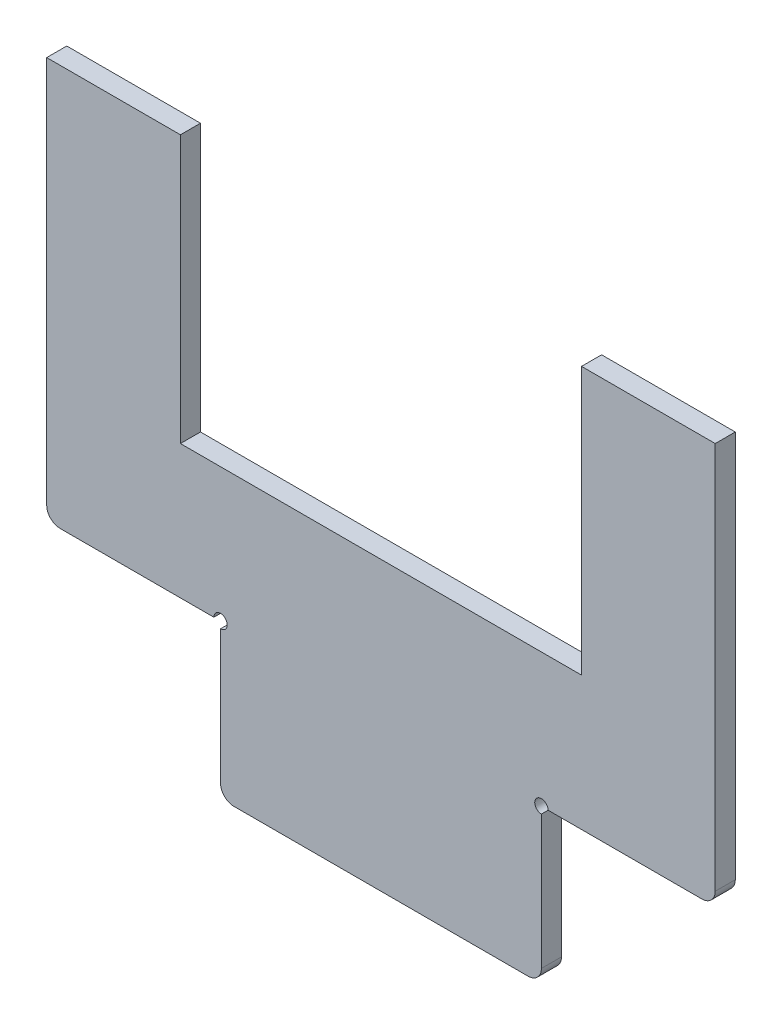
ISO-10303-21;
HEADER;
FILE_DESCRIPTION(('STEP AP214'),'2;1');
FILE_NAME('part.step','',(''),(''),'','','');
FILE_SCHEMA(('AUTOMOTIVE_DESIGN { 1 0 10303 214 1 1 1 1 }'));
ENDSEC;
DATA;
#1=APPLICATION_CONTEXT('core data for automotive mechanical design processes');
#2=APPLICATION_PROTOCOL_DEFINITION('international standard','automotive_design',2000,#1);
#3=PRODUCT_CONTEXT('',#1,'mechanical');
#4=PRODUCT('Part','Part','',(#3));
#5=PRODUCT_RELATED_PRODUCT_CATEGORY('part','',(#4));
#6=PRODUCT_DEFINITION_FORMATION('','',#4);
#7=PRODUCT_DEFINITION_CONTEXT('part definition',#1,'design');
#8=PRODUCT_DEFINITION('design','',#6,#7);
#9=PRODUCT_DEFINITION_SHAPE('','',#8);
#10=(LENGTH_UNIT() NAMED_UNIT(*) SI_UNIT(.MILLI.,.METRE.));
#11=(NAMED_UNIT(*) PLANE_ANGLE_UNIT() SI_UNIT($,.RADIAN.));
#12=(NAMED_UNIT(*) SI_UNIT($,.STERADIAN.) SOLID_ANGLE_UNIT());
#13=UNCERTAINTY_MEASURE_WITH_UNIT(LENGTH_MEASURE(1.E-05),#10,'distance_accuracy_value','');
#14=(GEOMETRIC_REPRESENTATION_CONTEXT(3) GLOBAL_UNCERTAINTY_ASSIGNED_CONTEXT((#13)) GLOBAL_UNIT_ASSIGNED_CONTEXT((#10,
#11,#12)) REPRESENTATION_CONTEXT('',''));
#15=CARTESIAN_POINT('',(0.,0.,0.));
#16=DIRECTION('',(0.,0.,1.));
#17=DIRECTION('',(1.,0.,0.));
#18=AXIS2_PLACEMENT_3D('',#15,#16,#17);
#19=CARTESIAN_POINT('',(24.,-11.5,3.));
#20=DIRECTION('',(-1.,0.,0.));
#21=DIRECTION('',(0.,0.,1.));
#22=AXIS2_PLACEMENT_3D('',#19,#20,#21);
#23=PLANE('',#22);
#24=DIRECTION('',(0.,1.,0.));
#25=VECTOR('',#24,1.);
#26=CARTESIAN_POINT('',(24.,-11.5,3.));
#27=LINE('',#26,#25);
#28=CARTESIAN_POINT('',(24.,-9.5,3.));
#29=VERTEX_POINT('',#28);
#30=CARTESIAN_POINT('',(24.,10.5,3.));
#31=VERTEX_POINT('',#30);
#32=EDGE_CURVE('E177',#29,#31,#27,.T.);
#33=ORIENTED_EDGE('',*,*,#32,.F.);
#34=DIRECTION('',(0.,0.,-1.));
#35=VECTOR('',#34,1.);
#36=CARTESIAN_POINT('',(24.,-9.5,3.));
#37=LINE('',#36,#35);
#38=CARTESIAN_POINT('',(24.,-9.5,0.));
#39=VERTEX_POINT('',#38);
#40=EDGE_CURVE('E265',#29,#39,#37,.T.);
#41=ORIENTED_EDGE('',*,*,#40,.T.);
#42=DIRECTION('',(0.,1.,0.));
#43=VECTOR('',#42,1.);
#44=CARTESIAN_POINT('',(24.,-11.5,0.));
#45=LINE('',#44,#43);
#46=CARTESIAN_POINT('',(24.,10.5,0.));
#47=VERTEX_POINT('',#46);
#48=EDGE_CURVE('E200',#39,#47,#45,.T.);
#49=ORIENTED_EDGE('',*,*,#48,.T.);
#50=DIRECTION('',(0.,0.,1.));
#51=VECTOR('',#50,1.);
#52=CARTESIAN_POINT('',(24.,10.5,0.));
#53=LINE('',#52,#51);
#54=EDGE_CURVE('E290',#47,#31,#53,.T.);
#55=ORIENTED_EDGE('',*,*,#54,.T.);
#56=EDGE_LOOP('',(#33,#41,#49,#55));
#57=FACE_BOUND('',#56,.T.);
#58=ADVANCED_FACE('F33',(#57),#23,.F.);
#59=CARTESIAN_POINT('',(-24.,-11.5,3.));
#60=DIRECTION('',(1.,0.,0.));
#61=DIRECTION('',(0.,0.,-1.));
#62=AXIS2_PLACEMENT_3D('',#59,#60,#61);
#63=PLANE('',#62);
#64=DIRECTION('',(0.,-1.,0.));
#65=VECTOR('',#64,1.);
#66=CARTESIAN_POINT('',(-24.,-11.5,0.));
#67=LINE('',#66,#65);
#68=CARTESIAN_POINT('',(-24.,10.5,0.));
#69=VERTEX_POINT('',#68);
#70=CARTESIAN_POINT('',(-24.,-9.5,0.));
#71=VERTEX_POINT('',#70);
#72=EDGE_CURVE('E238',#69,#71,#67,.T.);
#73=ORIENTED_EDGE('',*,*,#72,.T.);
#74=DIRECTION('',(0.,0.,-1.));
#75=VECTOR('',#74,1.);
#76=CARTESIAN_POINT('',(-24.,-9.5,3.));
#77=LINE('',#76,#75);
#78=CARTESIAN_POINT('',(-24.,-9.5,3.));
#79=VERTEX_POINT('',#78);
#80=EDGE_CURVE('E11',#71,#79,#77,.F.);
#81=ORIENTED_EDGE('',*,*,#80,.T.);
#82=DIRECTION('',(0.,-1.,0.));
#83=VECTOR('',#82,1.);
#84=CARTESIAN_POINT('',(-24.,-11.5,3.));
#85=LINE('',#84,#83);
#86=CARTESIAN_POINT('',(-24.,10.5,3.));
#87=VERTEX_POINT('',#86);
#88=EDGE_CURVE('E231',#87,#79,#85,.T.);
#89=ORIENTED_EDGE('',*,*,#88,.F.);
#90=DIRECTION('',(0.,0.,1.));
#91=VECTOR('',#90,1.);
#92=CARTESIAN_POINT('',(-24.,10.5,0.));
#93=LINE('',#92,#91);
#94=EDGE_CURVE('E188',#87,#69,#93,.F.);
#95=ORIENTED_EDGE('',*,*,#94,.T.);
#96=EDGE_LOOP('',(#73,#81,#89,#95));
#97=FACE_BOUND('',#96,.T.);
#98=ADVANCED_FACE('F352',(#97),#63,.F.);
#99=CARTESIAN_POINT('',(-24.,-11.5,3.));
#100=DIRECTION('',(0.,1.,0.));
#101=DIRECTION('',(0.,0.,1.));
#102=AXIS2_PLACEMENT_3D('',#99,#100,#101);
#103=PLANE('',#102);
#104=DIRECTION('',(1.,0.,0.));
#105=VECTOR('',#104,1.);
#106=CARTESIAN_POINT('',(-24.,-11.5,0.));
#107=LINE('',#106,#105);
#108=CARTESIAN_POINT('',(-22.,-11.5,0.));
#109=VERTEX_POINT('',#108);
#110=CARTESIAN_POINT('',(22.,-11.5,0.));
#111=VERTEX_POINT('',#110);
#112=EDGE_CURVE('E232',#109,#111,#107,.T.);
#113=ORIENTED_EDGE('',*,*,#112,.T.);
#114=DIRECTION('',(0.,0.,-1.));
#115=VECTOR('',#114,1.);
#116=CARTESIAN_POINT('',(22.,-11.5,3.));
#117=LINE('',#116,#115);
#118=CARTESIAN_POINT('',(22.,-11.5,3.));
#119=VERTEX_POINT('',#118);
#120=EDGE_CURVE('E41',#111,#119,#117,.F.);
#121=ORIENTED_EDGE('',*,*,#120,.T.);
#122=DIRECTION('',(1.,0.,0.));
#123=VECTOR('',#122,1.);
#124=CARTESIAN_POINT('',(-24.,-11.5,3.));
#125=LINE('',#124,#123);
#126=CARTESIAN_POINT('',(-22.,-11.5,3.));
#127=VERTEX_POINT('',#126);
#128=EDGE_CURVE('E170',#127,#119,#125,.T.);
#129=ORIENTED_EDGE('',*,*,#128,.F.);
#130=DIRECTION('',(0.,0.,-1.));
#131=VECTOR('',#130,1.);
#132=CARTESIAN_POINT('',(-22.,-11.5,3.));
#133=LINE('',#132,#131);
#134=EDGE_CURVE('E268',#127,#109,#133,.T.);
#135=ORIENTED_EDGE('',*,*,#134,.T.);
#136=EDGE_LOOP('',(#113,#121,#129,#135));
#137=FACE_BOUND('',#136,.T.);
#138=ADVANCED_FACE('F273',(#137),#103,.F.);
#139=CARTESIAN_POINT('',(0.,0.,3.));
#140=DIRECTION('',(0.,0.,-1.));
#141=DIRECTION('',(-1.,0.,0.));
#142=AXIS2_PLACEMENT_3D('',#139,#140,#141);
#143=PLANE('',#142);
#144=DIRECTION('',(1.,0.,0.));
#145=VECTOR('',#144,1.);
#146=CARTESIAN_POINT('',(50.,11.5,3.));
#147=LINE('',#146,#145);
#148=CARTESIAN_POINT('',(25.,11.5,3.));
#149=VERTEX_POINT('',#148);
#150=CARTESIAN_POINT('',(48.,11.5,3.));
#151=VERTEX_POINT('',#150);
#152=EDGE_CURVE('E175',#149,#151,#147,.T.);
#153=ORIENTED_EDGE('',*,*,#152,.T.);
#154=CARTESIAN_POINT('',(48.,13.5,3.));
#155=DIRECTION('',(0.,0.,-1.));
#156=DIRECTION('',(-1.,0.,0.));
#157=AXIS2_PLACEMENT_3D('',#154,#155,#156);
#158=CIRCLE('',#157,2.);
#159=CARTESIAN_POINT('',(50.,13.5,3.));
#160=VERTEX_POINT('',#159);
#161=EDGE_CURVE('E250',#151,#160,#158,.F.);
#162=ORIENTED_EDGE('',*,*,#161,.T.);
#163=DIRECTION('',(0.,1.,0.));
#164=VECTOR('',#163,1.);
#165=CARTESIAN_POINT('',(50.,11.5,3.));
#166=LINE('',#165,#164);
#167=CARTESIAN_POINT('',(50.,71.5,3.));
#168=VERTEX_POINT('',#167);
#169=EDGE_CURVE('E186',#160,#168,#166,.T.);
#170=ORIENTED_EDGE('',*,*,#169,.T.);
#171=DIRECTION('',(-1.,0.,0.));
#172=VECTOR('',#171,1.);
#173=CARTESIAN_POINT('',(50.,71.5,3.));
#174=LINE('',#173,#172);
#175=CARTESIAN_POINT('',(30.,71.5,3.));
#176=VERTEX_POINT('',#175);
#177=EDGE_CURVE('E305',#168,#176,#174,.T.);
#178=ORIENTED_EDGE('',*,*,#177,.T.);
#179=DIRECTION('',(0.,-1.,0.));
#180=VECTOR('',#179,1.);
#181=CARTESIAN_POINT('',(30.,31.5,3.));
#182=LINE('',#181,#180);
#183=CARTESIAN_POINT('',(30.,31.5,3.));
#184=VERTEX_POINT('',#183);
#185=EDGE_CURVE('E303',#176,#184,#182,.T.);
#186=ORIENTED_EDGE('',*,*,#185,.T.);
#187=DIRECTION('',(-1.,0.,0.));
#188=VECTOR('',#187,1.);
#189=CARTESIAN_POINT('',(30.,31.5,3.));
#190=LINE('',#189,#188);
#191=CARTESIAN_POINT('',(-30.,31.5,3.));
#192=VERTEX_POINT('',#191);
#193=EDGE_CURVE('E300',#184,#192,#190,.T.);
#194=ORIENTED_EDGE('',*,*,#193,.T.);
#195=DIRECTION('',(0.,1.,0.));
#196=VECTOR('',#195,1.);
#197=CARTESIAN_POINT('',(-30.,31.5,3.));
#198=LINE('',#197,#196);
#199=CARTESIAN_POINT('',(-30.,71.5,3.));
#200=VERTEX_POINT('',#199);
#201=EDGE_CURVE('E297',#192,#200,#198,.T.);
#202=ORIENTED_EDGE('',*,*,#201,.T.);
#203=DIRECTION('',(-1.,0.,0.));
#204=VECTOR('',#203,1.);
#205=CARTESIAN_POINT('',(-50.,71.5,3.));
#206=LINE('',#205,#204);
#207=CARTESIAN_POINT('',(-50.,71.5,3.));
#208=VERTEX_POINT('',#207);
#209=EDGE_CURVE('E294',#200,#208,#206,.T.);
#210=ORIENTED_EDGE('',*,*,#209,.T.);
#211=DIRECTION('',(0.,-1.,0.));
#212=VECTOR('',#211,1.);
#213=CARTESIAN_POINT('',(-50.,11.5,3.));
#214=LINE('',#213,#212);
#215=CARTESIAN_POINT('',(-50.,13.5,3.));
#216=VERTEX_POINT('',#215);
#217=EDGE_CURVE('E184',#208,#216,#214,.T.);
#218=ORIENTED_EDGE('',*,*,#217,.T.);
#219=CARTESIAN_POINT('',(-48.,13.5,3.));
#220=DIRECTION('',(0.,0.,-1.));
#221=DIRECTION('',(-1.,0.,0.));
#222=AXIS2_PLACEMENT_3D('',#219,#220,#221);
#223=CIRCLE('',#222,2.);
#224=CARTESIAN_POINT('',(-48.,11.5,3.));
#225=VERTEX_POINT('',#224);
#226=EDGE_CURVE('E248',#216,#225,#223,.F.);
#227=ORIENTED_EDGE('',*,*,#226,.T.);
#228=CARTESIAN_POINT('',(-25.,11.5,3.));
#229=VERTEX_POINT('',#228);
#230=EDGE_CURVE('E183',#225,#229,#147,.T.);
#231=ORIENTED_EDGE('',*,*,#230,.T.);
#232=CARTESIAN_POINT('',(-24.,11.5,3.));
#233=DIRECTION('',(0.,0.,1.));
#234=DIRECTION('',(1.,0.,0.));
#235=AXIS2_PLACEMENT_3D('',#232,#233,#234);
#236=CIRCLE('',#235,1.);
#237=EDGE_CURVE('E283',#87,#229,#236,.T.);
#238=ORIENTED_EDGE('',*,*,#237,.F.);
#239=ORIENTED_EDGE('',*,*,#88,.T.);
#240=CARTESIAN_POINT('',(-22.,-9.5,3.));
#241=DIRECTION('',(0.,0.,-1.));
#242=DIRECTION('',(-1.,0.,0.));
#243=AXIS2_PLACEMENT_3D('',#240,#241,#242);
#244=CIRCLE('',#243,2.);
#245=EDGE_CURVE('E244',#79,#127,#244,.F.);
#246=ORIENTED_EDGE('',*,*,#245,.T.);
#247=ORIENTED_EDGE('',*,*,#128,.T.);
#248=CARTESIAN_POINT('',(22.,-9.5,3.));
#249=DIRECTION('',(0.,0.,-1.));
#250=DIRECTION('',(-1.,0.,0.));
#251=AXIS2_PLACEMENT_3D('',#248,#249,#250);
#252=CIRCLE('',#251,2.);
#253=EDGE_CURVE('E246',#119,#29,#252,.F.);
#254=ORIENTED_EDGE('',*,*,#253,.T.);
#255=ORIENTED_EDGE('',*,*,#32,.T.);
#256=CARTESIAN_POINT('',(24.,11.5,3.));
#257=DIRECTION('',(0.,0.,1.));
#258=DIRECTION('',(1.,0.,0.));
#259=AXIS2_PLACEMENT_3D('',#256,#257,#258);
#260=CIRCLE('',#259,1.);
#261=EDGE_CURVE('E161',#149,#31,#260,.T.);
#262=ORIENTED_EDGE('',*,*,#261,.F.);
#263=EDGE_LOOP('',(#153,#162,#170,#178,#186,#194,#202,#210,#218,#227,#231,#238,#239,#246,#247,
#254,#255,#262));
#264=FACE_BOUND('',#263,.T.);
#265=ADVANCED_FACE('F174',(#264),#143,.F.);
#266=CARTESIAN_POINT('',(0.,0.,0.));
#267=DIRECTION('',(0.,0.,-1.));
#268=DIRECTION('',(-1.,0.,0.));
#269=AXIS2_PLACEMENT_3D('',#266,#267,#268);
#270=PLANE('',#269);
#271=DIRECTION('',(0.,1.,0.));
#272=VECTOR('',#271,1.);
#273=CARTESIAN_POINT('',(50.,11.5,0.));
#274=LINE('',#273,#272);
#275=CARTESIAN_POINT('',(50.,13.5,0.));
#276=VERTEX_POINT('',#275);
#277=CARTESIAN_POINT('',(50.,71.5,0.));
#278=VERTEX_POINT('',#277);
#279=EDGE_CURVE('E195',#276,#278,#274,.T.);
#280=ORIENTED_EDGE('',*,*,#279,.F.);
#281=CARTESIAN_POINT('',(48.,13.5,0.));
#282=DIRECTION('',(0.,0.,-1.));
#283=DIRECTION('',(-1.,0.,0.));
#284=AXIS2_PLACEMENT_3D('',#281,#282,#283);
#285=CIRCLE('',#284,2.);
#286=CARTESIAN_POINT('',(48.,11.5,0.));
#287=VERTEX_POINT('',#286);
#288=EDGE_CURVE('E258',#276,#287,#285,.T.);
#289=ORIENTED_EDGE('',*,*,#288,.T.);
#290=DIRECTION('',(1.,0.,0.));
#291=VECTOR('',#290,1.);
#292=CARTESIAN_POINT('',(50.,11.5,0.));
#293=LINE('',#292,#291);
#294=CARTESIAN_POINT('',(25.,11.5,0.));
#295=VERTEX_POINT('',#294);
#296=EDGE_CURVE('E196',#295,#287,#293,.T.);
#297=ORIENTED_EDGE('',*,*,#296,.F.);
#298=CARTESIAN_POINT('',(24.,11.5,0.));
#299=DIRECTION('',(0.,0.,1.));
#300=DIRECTION('',(1.,0.,0.));
#301=AXIS2_PLACEMENT_3D('',#298,#299,#300);
#302=CIRCLE('',#301,1.);
#303=EDGE_CURVE('E164',#295,#47,#302,.T.);
#304=ORIENTED_EDGE('',*,*,#303,.T.);
#305=ORIENTED_EDGE('',*,*,#48,.F.);
#306=CARTESIAN_POINT('',(22.,-9.5,0.));
#307=DIRECTION('',(0.,0.,-1.));
#308=DIRECTION('',(-1.,0.,0.));
#309=AXIS2_PLACEMENT_3D('',#306,#307,#308);
#310=CIRCLE('',#309,2.);
#311=EDGE_CURVE('E54',#39,#111,#310,.T.);
#312=ORIENTED_EDGE('',*,*,#311,.T.);
#313=ORIENTED_EDGE('',*,*,#112,.F.);
#314=CARTESIAN_POINT('',(-22.,-9.5,0.));
#315=DIRECTION('',(0.,0.,-1.));
#316=DIRECTION('',(-1.,0.,0.));
#317=AXIS2_PLACEMENT_3D('',#314,#315,#316);
#318=CIRCLE('',#317,2.);
#319=EDGE_CURVE('E48',#109,#71,#318,.T.);
#320=ORIENTED_EDGE('',*,*,#319,.T.);
#321=ORIENTED_EDGE('',*,*,#72,.F.);
#322=CARTESIAN_POINT('',(-24.,11.5,0.));
#323=DIRECTION('',(0.,0.,1.));
#324=DIRECTION('',(1.,0.,0.));
#325=AXIS2_PLACEMENT_3D('',#322,#323,#324);
#326=CIRCLE('',#325,1.);
#327=CARTESIAN_POINT('',(-25.,11.5,0.));
#328=VERTEX_POINT('',#327);
#329=EDGE_CURVE('E286',#69,#328,#326,.T.);
#330=ORIENTED_EDGE('',*,*,#329,.T.);
#331=CARTESIAN_POINT('',(-48.,11.5,0.));
#332=VERTEX_POINT('',#331);
#333=EDGE_CURVE('E193',#332,#328,#293,.T.);
#334=ORIENTED_EDGE('',*,*,#333,.F.);
#335=CARTESIAN_POINT('',(-48.,13.5,0.));
#336=DIRECTION('',(0.,0.,-1.));
#337=DIRECTION('',(-1.,0.,0.));
#338=AXIS2_PLACEMENT_3D('',#335,#336,#337);
#339=CIRCLE('',#338,2.);
#340=CARTESIAN_POINT('',(-50.,13.5,0.));
#341=VERTEX_POINT('',#340);
#342=EDGE_CURVE('E256',#332,#341,#339,.T.);
#343=ORIENTED_EDGE('',*,*,#342,.T.);
#344=DIRECTION('',(0.,-1.,0.));
#345=VECTOR('',#344,1.);
#346=CARTESIAN_POINT('',(-50.,11.5,0.));
#347=LINE('',#346,#345);
#348=CARTESIAN_POINT('',(-50.,71.5,0.));
#349=VERTEX_POINT('',#348);
#350=EDGE_CURVE('E197',#349,#341,#347,.T.);
#351=ORIENTED_EDGE('',*,*,#350,.F.);
#352=DIRECTION('',(-1.,0.,0.));
#353=VECTOR('',#352,1.);
#354=CARTESIAN_POINT('',(-50.,71.5,0.));
#355=LINE('',#354,#353);
#356=CARTESIAN_POINT('',(-30.,71.5,0.));
#357=VERTEX_POINT('',#356);
#358=EDGE_CURVE('E202',#357,#349,#355,.T.);
#359=ORIENTED_EDGE('',*,*,#358,.F.);
#360=DIRECTION('',(0.,1.,0.));
#361=VECTOR('',#360,1.);
#362=CARTESIAN_POINT('',(-30.,31.5,0.));
#363=LINE('',#362,#361);
#364=CARTESIAN_POINT('',(-30.,31.5,0.));
#365=VERTEX_POINT('',#364);
#366=EDGE_CURVE('E206',#365,#357,#363,.T.);
#367=ORIENTED_EDGE('',*,*,#366,.F.);
#368=DIRECTION('',(-1.,0.,0.));
#369=VECTOR('',#368,1.);
#370=CARTESIAN_POINT('',(30.,31.5,0.));
#371=LINE('',#370,#369);
#372=CARTESIAN_POINT('',(30.,31.5,0.));
#373=VERTEX_POINT('',#372);
#374=EDGE_CURVE('E210',#373,#365,#371,.T.);
#375=ORIENTED_EDGE('',*,*,#374,.F.);
#376=DIRECTION('',(0.,-1.,0.));
#377=VECTOR('',#376,1.);
#378=CARTESIAN_POINT('',(30.,31.5,0.));
#379=LINE('',#378,#377);
#380=CARTESIAN_POINT('',(30.,71.5,0.));
#381=VERTEX_POINT('',#380);
#382=EDGE_CURVE('E214',#381,#373,#379,.T.);
#383=ORIENTED_EDGE('',*,*,#382,.F.);
#384=DIRECTION('',(-1.,0.,0.));
#385=VECTOR('',#384,1.);
#386=CARTESIAN_POINT('',(50.,71.5,0.));
#387=LINE('',#386,#385);
#388=EDGE_CURVE('E218',#278,#381,#387,.T.);
#389=ORIENTED_EDGE('',*,*,#388,.F.);
#390=EDGE_LOOP('',(#280,#289,#297,#304,#305,#312,#313,#320,#321,#330,#334,#343,#351,#359,#367,
#375,#383,#389));
#391=FACE_BOUND('',#390,.T.);
#392=ADVANCED_FACE('F282',(#391),#270,.T.);
#393=CARTESIAN_POINT('',(50.,11.5,-116.619037896906));
#394=DIRECTION('',(0.,-1.,0.));
#395=DIRECTION('',(0.,0.,-1.));
#396=AXIS2_PLACEMENT_3D('',#393,#394,#395);
#397=PLANE('',#396);
#398=ORIENTED_EDGE('',*,*,#230,.F.);
#399=DIRECTION('',(0.,0.,1.));
#400=VECTOR('',#399,1.);
#401=CARTESIAN_POINT('',(-48.,11.5,-116.619037896906));
#402=LINE('',#401,#400);
#403=EDGE_CURVE('E263',#225,#332,#402,.F.);
#404=ORIENTED_EDGE('',*,*,#403,.T.);
#405=ORIENTED_EDGE('',*,*,#333,.T.);
#406=DIRECTION('',(0.,0.,1.));
#407=VECTOR('',#406,1.);
#408=CARTESIAN_POINT('',(-25.,11.5,0.));
#409=LINE('',#408,#407);
#410=EDGE_CURVE('E169',#229,#328,#409,.F.);
#411=ORIENTED_EDGE('',*,*,#410,.F.);
#412=EDGE_LOOP('',(#398,#404,#405,#411));
#413=FACE_BOUND('',#412,.T.);
#414=ADVANCED_FACE('F344',(#413),#397,.T.);
#415=ORIENTED_EDGE('',*,*,#296,.T.);
#416=DIRECTION('',(0.,0.,1.));
#417=VECTOR('',#416,1.);
#418=CARTESIAN_POINT('',(48.,11.5,-116.619037896906));
#419=LINE('',#418,#417);
#420=EDGE_CURVE('E182',#287,#151,#419,.T.);
#421=ORIENTED_EDGE('',*,*,#420,.T.);
#422=ORIENTED_EDGE('',*,*,#152,.F.);
#423=DIRECTION('',(0.,0.,1.));
#424=VECTOR('',#423,1.);
#425=CARTESIAN_POINT('',(25.,11.5,0.));
#426=LINE('',#425,#424);
#427=EDGE_CURVE('E157',#295,#149,#426,.T.);
#428=ORIENTED_EDGE('',*,*,#427,.F.);
#429=EDGE_LOOP('',(#415,#421,#422,#428));
#430=FACE_BOUND('',#429,.T.);
#431=ADVANCED_FACE('F180',(#430),#397,.T.);
#432=CARTESIAN_POINT('',(50.,11.5,-116.619037896906));
#433=DIRECTION('',(1.,0.,0.));
#434=DIRECTION('',(0.,0.,-1.));
#435=AXIS2_PLACEMENT_3D('',#432,#433,#434);
#436=PLANE('',#435);
#437=ORIENTED_EDGE('',*,*,#169,.F.);
#438=DIRECTION('',(0.,0.,1.));
#439=VECTOR('',#438,1.);
#440=CARTESIAN_POINT('',(50.,13.5,-116.619037896906));
#441=LINE('',#440,#439);
#442=EDGE_CURVE('E252',#160,#276,#441,.F.);
#443=ORIENTED_EDGE('',*,*,#442,.T.);
#444=ORIENTED_EDGE('',*,*,#279,.T.);
#445=DIRECTION('',(0.,0.,1.));
#446=VECTOR('',#445,1.);
#447=CARTESIAN_POINT('',(50.,71.5,-116.619037896906));
#448=LINE('',#447,#446);
#449=EDGE_CURVE('E221',#278,#168,#448,.T.);
#450=ORIENTED_EDGE('',*,*,#449,.T.);
#451=EDGE_LOOP('',(#437,#443,#444,#450));
#452=FACE_BOUND('',#451,.T.);
#453=ADVANCED_FACE('F312',(#452),#436,.T.);
#454=CARTESIAN_POINT('',(50.,71.5,-116.619037896906));
#455=DIRECTION('',(0.,1.,0.));
#456=DIRECTION('',(-1.,0.,0.));
#457=AXIS2_PLACEMENT_3D('',#454,#455,#456);
#458=PLANE('',#457);
#459=ORIENTED_EDGE('',*,*,#449,.F.);
#460=ORIENTED_EDGE('',*,*,#388,.T.);
#461=DIRECTION('',(0.,0.,1.));
#462=VECTOR('',#461,1.);
#463=CARTESIAN_POINT('',(30.,71.5,-116.619037896906));
#464=LINE('',#463,#462);
#465=EDGE_CURVE('E217',#381,#176,#464,.T.);
#466=ORIENTED_EDGE('',*,*,#465,.T.);
#467=ORIENTED_EDGE('',*,*,#177,.F.);
#468=EDGE_LOOP('',(#459,#460,#466,#467));
#469=FACE_BOUND('',#468,.T.);
#470=ADVANCED_FACE('F315',(#469),#458,.T.);
#471=CARTESIAN_POINT('',(30.,31.5,-116.619037896906));
#472=DIRECTION('',(-1.,0.,0.));
#473=DIRECTION('',(0.,0.,1.));
#474=AXIS2_PLACEMENT_3D('',#471,#472,#473);
#475=PLANE('',#474);
#476=ORIENTED_EDGE('',*,*,#465,.F.);
#477=ORIENTED_EDGE('',*,*,#382,.T.);
#478=DIRECTION('',(0.,0.,1.));
#479=VECTOR('',#478,1.);
#480=CARTESIAN_POINT('',(30.,31.5,-116.619037896906));
#481=LINE('',#480,#479);
#482=EDGE_CURVE('E213',#373,#184,#481,.T.);
#483=ORIENTED_EDGE('',*,*,#482,.T.);
#484=ORIENTED_EDGE('',*,*,#185,.F.);
#485=EDGE_LOOP('',(#476,#477,#483,#484));
#486=FACE_BOUND('',#485,.T.);
#487=ADVANCED_FACE('F319',(#486),#475,.T.);
#488=CARTESIAN_POINT('',(30.,31.5,-116.619037896906));
#489=DIRECTION('',(0.,1.,0.));
#490=DIRECTION('',(0.,0.,1.));
#491=AXIS2_PLACEMENT_3D('',#488,#489,#490);
#492=PLANE('',#491);
#493=ORIENTED_EDGE('',*,*,#482,.F.);
#494=ORIENTED_EDGE('',*,*,#374,.T.);
#495=DIRECTION('',(0.,0.,1.));
#496=VECTOR('',#495,1.);
#497=CARTESIAN_POINT('',(-30.,31.5,-116.619037896906));
#498=LINE('',#497,#496);
#499=EDGE_CURVE('E209',#365,#192,#498,.T.);
#500=ORIENTED_EDGE('',*,*,#499,.T.);
#501=ORIENTED_EDGE('',*,*,#193,.F.);
#502=EDGE_LOOP('',(#493,#494,#500,#501));
#503=FACE_BOUND('',#502,.T.);
#504=ADVANCED_FACE('F325',(#503),#492,.T.);
#505=CARTESIAN_POINT('',(-30.,31.5,-116.619037896906));
#506=DIRECTION('',(1.,0.,0.));
#507=DIRECTION('',(0.,0.,-1.));
#508=AXIS2_PLACEMENT_3D('',#505,#506,#507);
#509=PLANE('',#508);
#510=ORIENTED_EDGE('',*,*,#499,.F.);
#511=ORIENTED_EDGE('',*,*,#366,.T.);
#512=DIRECTION('',(0.,0.,1.));
#513=VECTOR('',#512,1.);
#514=CARTESIAN_POINT('',(-30.,71.5,-116.619037896906));
#515=LINE('',#514,#513);
#516=EDGE_CURVE('E205',#357,#200,#515,.T.);
#517=ORIENTED_EDGE('',*,*,#516,.T.);
#518=ORIENTED_EDGE('',*,*,#201,.F.);
#519=EDGE_LOOP('',(#510,#511,#517,#518));
#520=FACE_BOUND('',#519,.T.);
#521=ADVANCED_FACE('F328',(#520),#509,.T.);
#522=CARTESIAN_POINT('',(-50.,71.5,-116.619037896906));
#523=DIRECTION('',(0.,1.,0.));
#524=DIRECTION('',(-1.,0.,0.));
#525=AXIS2_PLACEMENT_3D('',#522,#523,#524);
#526=PLANE('',#525);
#527=ORIENTED_EDGE('',*,*,#516,.F.);
#528=ORIENTED_EDGE('',*,*,#358,.T.);
#529=DIRECTION('',(0.,0.,1.));
#530=VECTOR('',#529,1.);
#531=CARTESIAN_POINT('',(-50.,71.5,-116.619037896906));
#532=LINE('',#531,#530);
#533=EDGE_CURVE('E201',#349,#208,#532,.T.);
#534=ORIENTED_EDGE('',*,*,#533,.T.);
#535=ORIENTED_EDGE('',*,*,#209,.F.);
#536=EDGE_LOOP('',(#527,#528,#534,#535));
#537=FACE_BOUND('',#536,.T.);
#538=ADVANCED_FACE('F331',(#537),#526,.T.);
#539=CARTESIAN_POINT('',(-50.,11.5,-116.619037896906));
#540=DIRECTION('',(-1.,0.,0.));
#541=DIRECTION('',(0.,0.,1.));
#542=AXIS2_PLACEMENT_3D('',#539,#540,#541);
#543=PLANE('',#542);
#544=ORIENTED_EDGE('',*,*,#350,.T.);
#545=DIRECTION('',(0.,0.,1.));
#546=VECTOR('',#545,1.);
#547=CARTESIAN_POINT('',(-50.,13.5,-116.619037896906));
#548=LINE('',#547,#546);
#549=EDGE_CURVE('E260',#341,#216,#548,.T.);
#550=ORIENTED_EDGE('',*,*,#549,.T.);
#551=ORIENTED_EDGE('',*,*,#217,.F.);
#552=ORIENTED_EDGE('',*,*,#533,.F.);
#553=EDGE_LOOP('',(#544,#550,#551,#552));
#554=FACE_BOUND('',#553,.T.);
#555=ADVANCED_FACE('F336',(#554),#543,.T.);
#556=CARTESIAN_POINT('',(24.,11.5,0.));
#557=DIRECTION('',(0.,0.,1.));
#558=DIRECTION('',(1.,0.,0.));
#559=AXIS2_PLACEMENT_3D('',#556,#557,#558);
#560=CYLINDRICAL_SURFACE('',#559,1.);
#561=ORIENTED_EDGE('',*,*,#303,.F.);
#562=ORIENTED_EDGE('',*,*,#427,.T.);
#563=ORIENTED_EDGE('',*,*,#261,.T.);
#564=ORIENTED_EDGE('',*,*,#54,.F.);
#565=EDGE_LOOP('',(#561,#562,#563,#564));
#566=FACE_BOUND('',#565,.T.);
#567=ADVANCED_FACE('F159',(#566),#560,.F.);
#568=CARTESIAN_POINT('',(-24.,11.5,0.));
#569=DIRECTION('',(0.,0.,1.));
#570=DIRECTION('',(1.,0.,0.));
#571=AXIS2_PLACEMENT_3D('',#568,#569,#570);
#572=CYLINDRICAL_SURFACE('',#571,1.);
#573=ORIENTED_EDGE('',*,*,#237,.T.);
#574=ORIENTED_EDGE('',*,*,#410,.T.);
#575=ORIENTED_EDGE('',*,*,#329,.F.);
#576=ORIENTED_EDGE('',*,*,#94,.F.);
#577=EDGE_LOOP('',(#573,#574,#575,#576));
#578=FACE_BOUND('',#577,.T.);
#579=ADVANCED_FACE('F348',(#578),#572,.F.);
#580=CARTESIAN_POINT('',(48.,13.5,-116.619037896906));
#581=DIRECTION('',(0.,0.,1.));
#582=DIRECTION('',(1.,0.,0.));
#583=AXIS2_PLACEMENT_3D('',#580,#581,#582);
#584=CYLINDRICAL_SURFACE('',#583,2.);
#585=ORIENTED_EDGE('',*,*,#288,.F.);
#586=ORIENTED_EDGE('',*,*,#442,.F.);
#587=ORIENTED_EDGE('',*,*,#161,.F.);
#588=ORIENTED_EDGE('',*,*,#420,.F.);
#589=EDGE_LOOP('',(#585,#586,#587,#588));
#590=FACE_BOUND('',#589,.T.);
#591=ADVANCED_FACE('F367',(#590),#584,.T.);
#592=CARTESIAN_POINT('',(-48.,13.5,-116.619037896906));
#593=DIRECTION('',(0.,0.,1.));
#594=DIRECTION('',(1.,0.,0.));
#595=AXIS2_PLACEMENT_3D('',#592,#593,#594);
#596=CYLINDRICAL_SURFACE('',#595,2.);
#597=ORIENTED_EDGE('',*,*,#342,.F.);
#598=ORIENTED_EDGE('',*,*,#403,.F.);
#599=ORIENTED_EDGE('',*,*,#226,.F.);
#600=ORIENTED_EDGE('',*,*,#549,.F.);
#601=EDGE_LOOP('',(#597,#598,#599,#600));
#602=FACE_BOUND('',#601,.T.);
#603=ADVANCED_FACE('F340',(#602),#596,.T.);
#604=CARTESIAN_POINT('',(22.,-9.5,3.));
#605=DIRECTION('',(0.,0.,-1.));
#606=DIRECTION('',(-1.,0.,0.));
#607=AXIS2_PLACEMENT_3D('',#604,#605,#606);
#608=CYLINDRICAL_SURFACE('',#607,2.);
#609=ORIENTED_EDGE('',*,*,#253,.F.);
#610=ORIENTED_EDGE('',*,*,#120,.F.);
#611=ORIENTED_EDGE('',*,*,#311,.F.);
#612=ORIENTED_EDGE('',*,*,#40,.F.);
#613=EDGE_LOOP('',(#609,#610,#611,#612));
#614=FACE_BOUND('',#613,.T.);
#615=ADVANCED_FACE('F279',(#614),#608,.T.);
#616=CARTESIAN_POINT('',(-22.,-9.5,3.));
#617=DIRECTION('',(0.,0.,-1.));
#618=DIRECTION('',(-1.,0.,0.));
#619=AXIS2_PLACEMENT_3D('',#616,#617,#618);
#620=CYLINDRICAL_SURFACE('',#619,2.);
#621=ORIENTED_EDGE('',*,*,#245,.F.);
#622=ORIENTED_EDGE('',*,*,#80,.F.);
#623=ORIENTED_EDGE('',*,*,#319,.F.);
#624=ORIENTED_EDGE('',*,*,#134,.F.);
#625=EDGE_LOOP('',(#621,#622,#623,#624));
#626=FACE_BOUND('',#625,.T.);
#627=ADVANCED_FACE('F35',(#626),#620,.T.);
#628=CLOSED_SHELL('',(#58,#98,#138,#265,#392,#414,#431,#453,#470,#487,#504,#521,#538,#555,#567,
#579,#591,#603,#615,#627));
#629=MANIFOLD_SOLID_BREP('B2',#628);
#630=ADVANCED_BREP_SHAPE_REPRESENTATION('',(#18,#629),#14);
#631=SHAPE_DEFINITION_REPRESENTATION(#9,#630);
ENDSEC;
END-ISO-10303-21;
